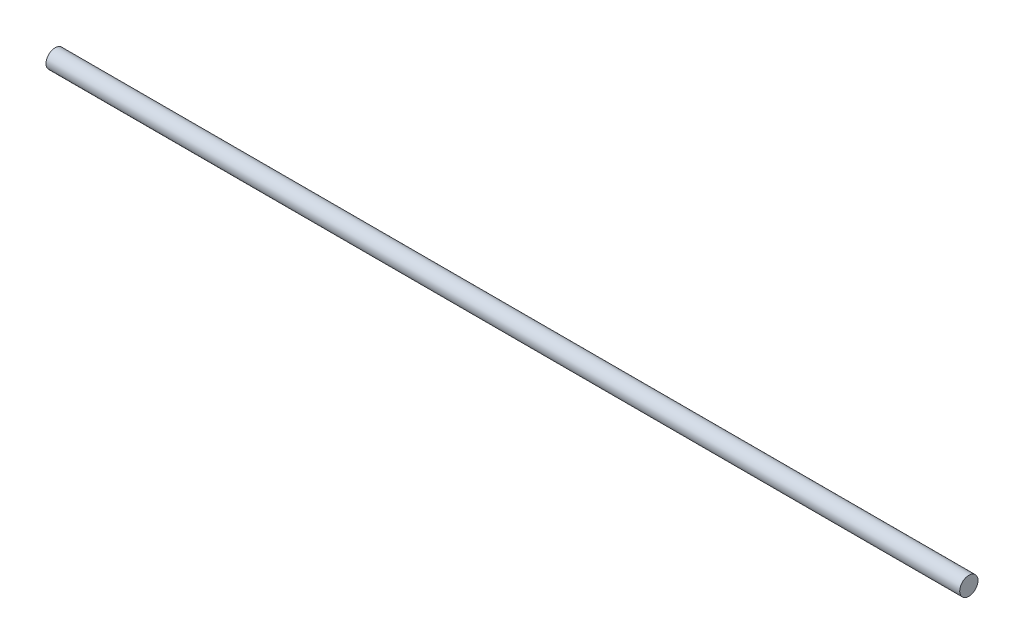
ISO-10303-21;
HEADER;
FILE_DESCRIPTION(('STEP AP214'),'2;1');
FILE_NAME('part.step','',(''),(''),'','','');
FILE_SCHEMA(('AUTOMOTIVE_DESIGN { 1 0 10303 214 1 1 1 1 }'));
ENDSEC;
DATA;
#1=APPLICATION_CONTEXT('core data for automotive mechanical design processes');
#2=APPLICATION_PROTOCOL_DEFINITION('international standard','automotive_design',2000,#1);
#3=PRODUCT_CONTEXT('',#1,'mechanical');
#4=PRODUCT('Part','Part','',(#3));
#5=PRODUCT_RELATED_PRODUCT_CATEGORY('part','',(#4));
#6=PRODUCT_DEFINITION_FORMATION('','',#4);
#7=PRODUCT_DEFINITION_CONTEXT('part definition',#1,'design');
#8=PRODUCT_DEFINITION('design','',#6,#7);
#9=PRODUCT_DEFINITION_SHAPE('','',#8);
#10=(LENGTH_UNIT() NAMED_UNIT(*) SI_UNIT(.MILLI.,.METRE.));
#11=(NAMED_UNIT(*) PLANE_ANGLE_UNIT() SI_UNIT($,.RADIAN.));
#12=(NAMED_UNIT(*) SI_UNIT($,.STERADIAN.) SOLID_ANGLE_UNIT());
#13=UNCERTAINTY_MEASURE_WITH_UNIT(LENGTH_MEASURE(1.E-05),#10,'distance_accuracy_value','');
#14=(GEOMETRIC_REPRESENTATION_CONTEXT(3) GLOBAL_UNCERTAINTY_ASSIGNED_CONTEXT((#13)) GLOBAL_UNIT_ASSIGNED_CONTEXT((#10,
#11,#12)) REPRESENTATION_CONTEXT('',''));
#15=CARTESIAN_POINT('',(0.,0.,0.));
#16=DIRECTION('',(0.,0.,1.));
#17=DIRECTION('',(1.,0.,0.));
#18=AXIS2_PLACEMENT_3D('',#15,#16,#17);
#19=CARTESIAN_POINT('',(400.,0.,0.));
#20=DIRECTION('',(-1.,0.,0.));
#21=DIRECTION('',(0.,0.,1.));
#22=AXIS2_PLACEMENT_3D('',#19,#20,#21);
#23=CYLINDRICAL_SURFACE('',#22,4.);
#24=CARTESIAN_POINT('',(400.,0.,0.));
#25=DIRECTION('',(1.,0.,0.));
#26=DIRECTION('',(0.,0.,-1.));
#27=AXIS2_PLACEMENT_3D('',#24,#25,#26);
#28=CIRCLE('',#27,4.);
#29=CARTESIAN_POINT('',(400.,0.,-4.));
#30=VERTEX_POINT('',#29);
#31=EDGE_CURVE('E10',#30,#30,#28,.T.);
#32=ORIENTED_EDGE('',*,*,#31,.F.);
#33=EDGE_LOOP('',(#32));
#34=FACE_BOUND('',#33,.T.);
#35=CARTESIAN_POINT('',(0.,0.,0.));
#36=DIRECTION('',(1.,0.,0.));
#37=DIRECTION('',(0.,0.,-1.));
#38=AXIS2_PLACEMENT_3D('',#35,#36,#37);
#39=CIRCLE('',#38,4.);
#40=CARTESIAN_POINT('',(0.,0.,-4.));
#41=VERTEX_POINT('',#40);
#42=EDGE_CURVE('E33',#41,#41,#39,.T.);
#43=ORIENTED_EDGE('',*,*,#42,.T.);
#44=EDGE_LOOP('',(#43));
#45=FACE_BOUND('',#44,.T.);
#46=ADVANCED_FACE('F30',(#34,#45),#23,.T.);
#47=CARTESIAN_POINT('',(400.,0.,0.));
#48=DIRECTION('',(1.,0.,0.));
#49=DIRECTION('',(0.,0.,-1.));
#50=AXIS2_PLACEMENT_3D('',#47,#48,#49);
#51=PLANE('',#50);
#52=ORIENTED_EDGE('',*,*,#31,.T.);
#53=EDGE_LOOP('',(#52));
#54=FACE_BOUND('',#53,.T.);
#55=ADVANCED_FACE('F45',(#54),#51,.T.);
#56=CARTESIAN_POINT('',(0.,0.,0.));
#57=DIRECTION('',(1.,0.,0.));
#58=DIRECTION('',(0.,0.,-1.));
#59=AXIS2_PLACEMENT_3D('',#56,#57,#58);
#60=PLANE('',#59);
#61=ORIENTED_EDGE('',*,*,#42,.F.);
#62=EDGE_LOOP('',(#61));
#63=FACE_BOUND('',#62,.T.);
#64=ADVANCED_FACE('F43',(#63),#60,.F.);
#65=CLOSED_SHELL('',(#46,#55,#64));
#66=MANIFOLD_SOLID_BREP('B2',#65);
#67=ADVANCED_BREP_SHAPE_REPRESENTATION('',(#18,#66),#14);
#68=SHAPE_DEFINITION_REPRESENTATION(#9,#67);
ENDSEC;
END-ISO-10303-21;
